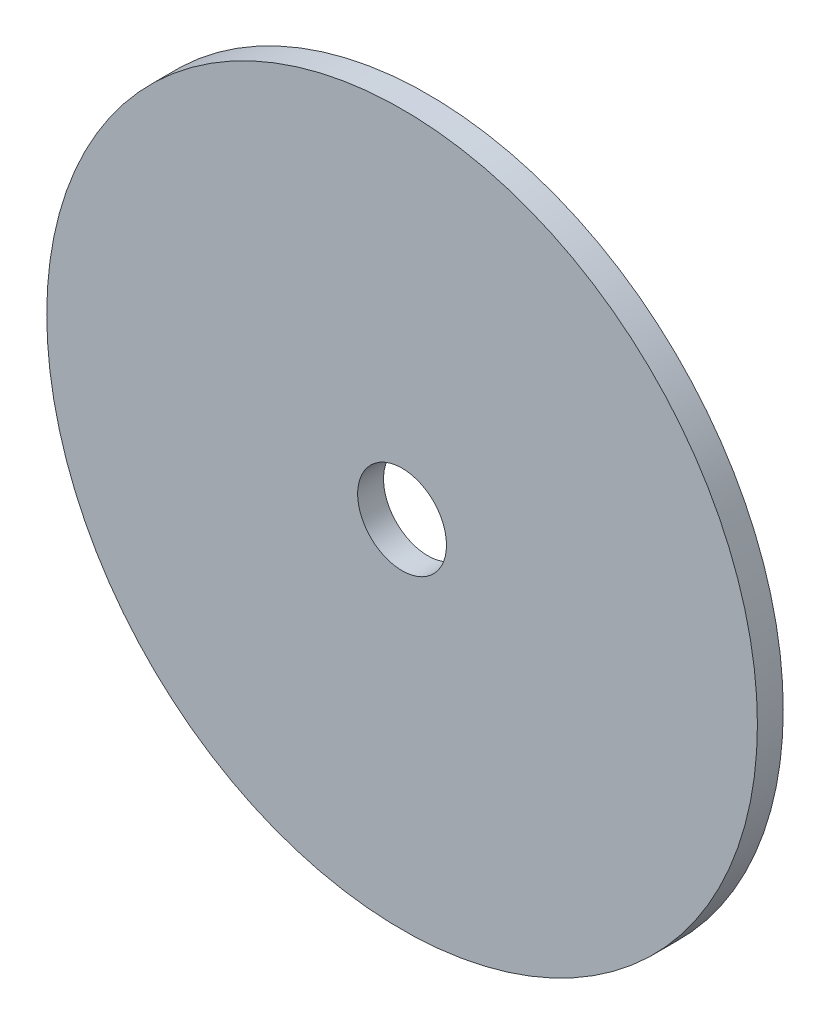
ISO-10303-21;
HEADER;
FILE_DESCRIPTION(('STEP AP214'),'2;1');
FILE_NAME('part.step','',(''),(''),'','','');
FILE_SCHEMA(('AUTOMOTIVE_DESIGN { 1 0 10303 214 1 1 1 1 }'));
ENDSEC;
DATA;
#1=APPLICATION_CONTEXT('core data for automotive mechanical design processes');
#2=APPLICATION_PROTOCOL_DEFINITION('international standard','automotive_design',2000,#1);
#3=PRODUCT_CONTEXT('',#1,'mechanical');
#4=PRODUCT('Part','Part','',(#3));
#5=PRODUCT_RELATED_PRODUCT_CATEGORY('part','',(#4));
#6=PRODUCT_DEFINITION_FORMATION('','',#4);
#7=PRODUCT_DEFINITION_CONTEXT('part definition',#1,'design');
#8=PRODUCT_DEFINITION('design','',#6,#7);
#9=PRODUCT_DEFINITION_SHAPE('','',#8);
#10=(LENGTH_UNIT() NAMED_UNIT(*) SI_UNIT(.MILLI.,.METRE.));
#11=(NAMED_UNIT(*) PLANE_ANGLE_UNIT() SI_UNIT($,.RADIAN.));
#12=(NAMED_UNIT(*) SI_UNIT($,.STERADIAN.) SOLID_ANGLE_UNIT());
#13=UNCERTAINTY_MEASURE_WITH_UNIT(LENGTH_MEASURE(1.E-05),#10,'distance_accuracy_value','');
#14=(GEOMETRIC_REPRESENTATION_CONTEXT(3) GLOBAL_UNCERTAINTY_ASSIGNED_CONTEXT((#13)) GLOBAL_UNIT_ASSIGNED_CONTEXT((#10,
#11,#12)) REPRESENTATION_CONTEXT('',''));
#15=CARTESIAN_POINT('',(0.,0.,0.));
#16=DIRECTION('',(0.,0.,1.));
#17=DIRECTION('',(1.,0.,0.));
#18=AXIS2_PLACEMENT_3D('',#15,#16,#17);
#19=CARTESIAN_POINT('',(0.,0.,-3.16233129581243));
#20=DIRECTION('',(0.,0.,1.));
#21=DIRECTION('',(1.,0.,0.));
#22=AXIS2_PLACEMENT_3D('',#19,#20,#21);
#23=CYLINDRICAL_SURFACE('',#22,60.);
#24=CARTESIAN_POINT('',(0.,0.,-3.16233129581243));
#25=DIRECTION('',(0.,0.,1.));
#26=DIRECTION('',(1.,0.,0.));
#27=AXIS2_PLACEMENT_3D('',#24,#25,#26);
#28=CIRCLE('',#27,60.);
#29=CARTESIAN_POINT('',(60.,0.,-3.16233129581243));
#30=VERTEX_POINT('',#29);
#31=EDGE_CURVE('E43',#30,#30,#28,.T.);
#32=ORIENTED_EDGE('',*,*,#31,.T.);
#33=EDGE_LOOP('',(#32));
#34=FACE_BOUND('',#33,.T.);
#35=CARTESIAN_POINT('',(0.,0.,1.2));
#36=DIRECTION('',(0.,0.,1.));
#37=DIRECTION('',(1.,0.,0.));
#38=AXIS2_PLACEMENT_3D('',#35,#36,#37);
#39=CIRCLE('',#38,60.);
#40=CARTESIAN_POINT('',(60.,0.,1.2));
#41=VERTEX_POINT('',#40);
#42=EDGE_CURVE('E51',#41,#41,#39,.T.);
#43=ORIENTED_EDGE('',*,*,#42,.F.);
#44=EDGE_LOOP('',(#43));
#45=FACE_BOUND('',#44,.T.);
#46=ADVANCED_FACE('F37',(#34,#45),#23,.T.);
#47=CARTESIAN_POINT('',(0.,0.,-3.16233129581243));
#48=DIRECTION('',(0.,0.,1.));
#49=DIRECTION('',(1.,0.,0.));
#50=AXIS2_PLACEMENT_3D('',#47,#48,#49);
#51=CYLINDRICAL_SURFACE('',#50,7.5);
#52=CARTESIAN_POINT('',(0.,0.,-3.16233129581243));
#53=DIRECTION('',(0.,0.,1.));
#54=DIRECTION('',(1.,0.,0.));
#55=AXIS2_PLACEMENT_3D('',#52,#53,#54);
#56=CIRCLE('',#55,7.5);
#57=CARTESIAN_POINT('',(7.5,0.,-3.16233129581243));
#58=VERTEX_POINT('',#57);
#59=EDGE_CURVE('E10',#58,#58,#56,.T.);
#60=ORIENTED_EDGE('',*,*,#59,.F.);
#61=EDGE_LOOP('',(#60));
#62=FACE_BOUND('',#61,.T.);
#63=CARTESIAN_POINT('',(0.,0.,1.2));
#64=DIRECTION('',(0.,0.,1.));
#65=DIRECTION('',(1.,0.,0.));
#66=AXIS2_PLACEMENT_3D('',#63,#64,#65);
#67=CIRCLE('',#66,7.5);
#68=CARTESIAN_POINT('',(7.5,0.,1.2));
#69=VERTEX_POINT('',#68);
#70=EDGE_CURVE('E47',#69,#69,#67,.T.);
#71=ORIENTED_EDGE('',*,*,#70,.T.);
#72=EDGE_LOOP('',(#71));
#73=FACE_BOUND('',#72,.T.);
#74=ADVANCED_FACE('F61',(#62,#73),#51,.F.);
#75=CARTESIAN_POINT('',(0.,0.,-3.16233129581243));
#76=DIRECTION('',(0.,0.,1.));
#77=DIRECTION('',(1.,0.,0.));
#78=AXIS2_PLACEMENT_3D('',#75,#76,#77);
#79=PLANE('',#78);
#80=ORIENTED_EDGE('',*,*,#31,.F.);
#81=EDGE_LOOP('',(#80));
#82=FACE_BOUND('',#81,.T.);
#83=ORIENTED_EDGE('',*,*,#59,.T.);
#84=EDGE_LOOP('',(#83));
#85=FACE_BOUND('',#84,.T.);
#86=ADVANCED_FACE('F65',(#82,#85),#79,.F.);
#87=CARTESIAN_POINT('',(0.,0.,1.2));
#88=DIRECTION('',(0.,0.,1.));
#89=DIRECTION('',(1.,0.,0.));
#90=AXIS2_PLACEMENT_3D('',#87,#88,#89);
#91=PLANE('',#90);
#92=ORIENTED_EDGE('',*,*,#42,.T.);
#93=EDGE_LOOP('',(#92));
#94=FACE_BOUND('',#93,.T.);
#95=ORIENTED_EDGE('',*,*,#70,.F.);
#96=EDGE_LOOP('',(#95));
#97=FACE_BOUND('',#96,.T.);
#98=ADVANCED_FACE('F57',(#94,#97),#91,.T.);
#99=CLOSED_SHELL('',(#46,#74,#86,#98));
#100=MANIFOLD_SOLID_BREP('B2',#99);
#101=ADVANCED_BREP_SHAPE_REPRESENTATION('',(#18,#100),#14);
#102=SHAPE_DEFINITION_REPRESENTATION(#9,#101);
ENDSEC;
END-ISO-10303-21;
